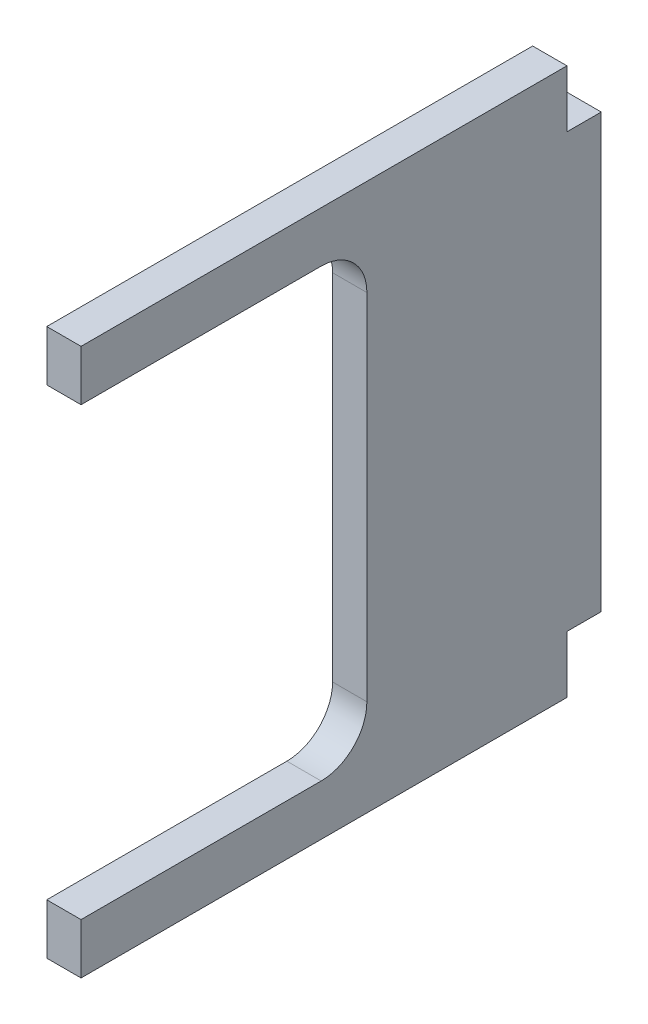
ISO-10303-21;
HEADER;
FILE_DESCRIPTION(('STEP AP214'),'2;1');
FILE_NAME('part.step','',(''),(''),'','','');
FILE_SCHEMA(('AUTOMOTIVE_DESIGN { 1 0 10303 214 1 1 1 1 }'));
ENDSEC;
DATA;
#1=APPLICATION_CONTEXT('core data for automotive mechanical design processes');
#2=APPLICATION_PROTOCOL_DEFINITION('international standard','automotive_design',2000,#1);
#3=PRODUCT_CONTEXT('',#1,'mechanical');
#4=PRODUCT('Part','Part','',(#3));
#5=PRODUCT_RELATED_PRODUCT_CATEGORY('part','',(#4));
#6=PRODUCT_DEFINITION_FORMATION('','',#4);
#7=PRODUCT_DEFINITION_CONTEXT('part definition',#1,'design');
#8=PRODUCT_DEFINITION('design','',#6,#7);
#9=PRODUCT_DEFINITION_SHAPE('','',#8);
#10=(LENGTH_UNIT() NAMED_UNIT(*) SI_UNIT(.MILLI.,.METRE.));
#11=(NAMED_UNIT(*) PLANE_ANGLE_UNIT() SI_UNIT($,.RADIAN.));
#12=(NAMED_UNIT(*) SI_UNIT($,.STERADIAN.) SOLID_ANGLE_UNIT());
#13=UNCERTAINTY_MEASURE_WITH_UNIT(LENGTH_MEASURE(1.E-05),#10,'distance_accuracy_value','');
#14=(GEOMETRIC_REPRESENTATION_CONTEXT(3) GLOBAL_UNCERTAINTY_ASSIGNED_CONTEXT((#13)) GLOBAL_UNIT_ASSIGNED_CONTEXT((#10,
#11,#12)) REPRESENTATION_CONTEXT('',''));
#15=CARTESIAN_POINT('',(0.,0.,0.));
#16=DIRECTION('',(0.,0.,1.));
#17=DIRECTION('',(1.,0.,0.));
#18=AXIS2_PLACEMENT_3D('',#15,#16,#17);
#19=CARTESIAN_POINT('',(-226.5,-18.9239385297092,55.466587914966));
#20=DIRECTION('',(1.,0.,0.));
#21=DIRECTION('',(0.,0.,-1.));
#22=AXIS2_PLACEMENT_3D('',#19,#20,#21);
#23=PLANE('',#22);
#24=DIRECTION('',(0.,0.,1.));
#25=VECTOR('',#24,1.);
#26=CARTESIAN_POINT('',(-226.5,-19.5000000000002,55.466587914966));
#27=LINE('',#26,#25);
#28=CARTESIAN_POINT('',(-226.5,-19.5000000000002,21.5));
#29=VERTEX_POINT('',#28);
#30=CARTESIAN_POINT('',(-226.5,-19.5000000000002,42.5));
#31=VERTEX_POINT('',#30);
#32=EDGE_CURVE('E150',#29,#31,#27,.T.);
#33=ORIENTED_EDGE('',*,*,#32,.F.);
#34=CARTESIAN_POINT('',(-226.5,-15.5000000000002,21.5));
#35=DIRECTION('',(1.,0.,0.));
#36=DIRECTION('',(0.,0.,-1.));
#37=AXIS2_PLACEMENT_3D('',#34,#35,#36);
#38=CIRCLE('',#37,4.);
#39=CARTESIAN_POINT('',(-226.5,-15.5000000000002,17.5));
#40=VERTEX_POINT('',#39);
#41=EDGE_CURVE('E11',#29,#40,#38,.T.);
#42=ORIENTED_EDGE('',*,*,#41,.T.);
#43=DIRECTION('',(0.,-1.,0.));
#44=VECTOR('',#43,1.);
#45=CARTESIAN_POINT('',(-226.5,-18.9239385297092,17.5));
#46=LINE('',#45,#44);
#47=CARTESIAN_POINT('',(-226.5,15.5000000000002,17.5));
#48=VERTEX_POINT('',#47);
#49=EDGE_CURVE('E219',#48,#40,#46,.T.);
#50=ORIENTED_EDGE('',*,*,#49,.F.);
#51=CARTESIAN_POINT('',(-226.5,15.5000000000002,21.5));
#52=DIRECTION('',(1.,0.,0.));
#53=DIRECTION('',(0.,0.,-1.));
#54=AXIS2_PLACEMENT_3D('',#51,#52,#53);
#55=CIRCLE('',#54,4.);
#56=CARTESIAN_POINT('',(-226.5,19.5000000000002,21.5));
#57=VERTEX_POINT('',#56);
#58=EDGE_CURVE('E225',#48,#57,#55,.T.);
#59=ORIENTED_EDGE('',*,*,#58,.T.);
#60=DIRECTION('',(0.,0.,1.));
#61=VECTOR('',#60,1.);
#62=CARTESIAN_POINT('',(-226.5,19.5000000000002,55.466587914966));
#63=LINE('',#62,#61);
#64=CARTESIAN_POINT('',(-226.5,19.5000000000002,42.5));
#65=VERTEX_POINT('',#64);
#66=EDGE_CURVE('E173',#57,#65,#63,.T.);
#67=ORIENTED_EDGE('',*,*,#66,.T.);
#68=DIRECTION('',(0.,-1.,0.));
#69=VECTOR('',#68,1.);
#70=CARTESIAN_POINT('',(-226.5,23.9239385297092,42.5));
#71=LINE('',#70,#69);
#72=CARTESIAN_POINT('',(-226.5,23.9239385297092,42.5));
#73=VERTEX_POINT('',#72);
#74=EDGE_CURVE('E269',#73,#65,#71,.T.);
#75=ORIENTED_EDGE('',*,*,#74,.F.);
#76=DIRECTION('',(0.,0.,1.));
#77=VECTOR('',#76,1.);
#78=CARTESIAN_POINT('',(-226.5,23.9239385297092,0.));
#79=LINE('',#78,#77);
#80=CARTESIAN_POINT('',(-226.5,23.9239385297092,0.));
#81=VERTEX_POINT('',#80);
#82=EDGE_CURVE('E177',#81,#73,#79,.T.);
#83=ORIENTED_EDGE('',*,*,#82,.F.);
#84=DIRECTION('',(0.,-1.,0.));
#85=VECTOR('',#84,1.);
#86=CARTESIAN_POINT('',(-226.5,23.9239385297092,0.));
#87=LINE('',#86,#85);
#88=CARTESIAN_POINT('',(-226.5,18.9239385297092,0.));
#89=VERTEX_POINT('',#88);
#90=EDGE_CURVE('E189',#81,#89,#87,.T.);
#91=ORIENTED_EDGE('',*,*,#90,.T.);
#92=DIRECTION('',(0.,0.,-1.));
#93=VECTOR('',#92,1.);
#94=CARTESIAN_POINT('',(-226.5,18.9239385297092,55.466587914966));
#95=LINE('',#94,#93);
#96=CARTESIAN_POINT('',(-226.5,18.9239385297092,-3.));
#97=VERTEX_POINT('',#96);
#98=EDGE_CURVE('E198',#89,#97,#95,.T.);
#99=ORIENTED_EDGE('',*,*,#98,.T.);
#100=DIRECTION('',(0.,-1.,0.));
#101=VECTOR('',#100,1.);
#102=CARTESIAN_POINT('',(-226.5,-18.9239385297092,-3.));
#103=LINE('',#102,#101);
#104=CARTESIAN_POINT('',(-226.5,-18.9239385297092,-3.));
#105=VERTEX_POINT('',#104);
#106=EDGE_CURVE('E263',#97,#105,#103,.T.);
#107=ORIENTED_EDGE('',*,*,#106,.T.);
#108=DIRECTION('',(0.,0.,-1.));
#109=VECTOR('',#108,1.);
#110=CARTESIAN_POINT('',(-226.5,-18.9239385297092,55.466587914966));
#111=LINE('',#110,#109);
#112=CARTESIAN_POINT('',(-226.5,-18.9239385297092,0.));
#113=VERTEX_POINT('',#112);
#114=EDGE_CURVE('E240',#113,#105,#111,.T.);
#115=ORIENTED_EDGE('',*,*,#114,.F.);
#116=DIRECTION('',(0.,1.,0.));
#117=VECTOR('',#116,1.);
#118=CARTESIAN_POINT('',(-226.5,-23.9239385297092,0.));
#119=LINE('',#118,#117);
#120=CARTESIAN_POINT('',(-226.5,-23.9239385297092,0.));
#121=VERTEX_POINT('',#120);
#122=EDGE_CURVE('E161',#121,#113,#119,.T.);
#123=ORIENTED_EDGE('',*,*,#122,.F.);
#124=DIRECTION('',(0.,0.,1.));
#125=VECTOR('',#124,1.);
#126=CARTESIAN_POINT('',(-226.5,-23.9239385297092,0.));
#127=LINE('',#126,#125);
#128=CARTESIAN_POINT('',(-226.5,-23.9239385297092,42.5));
#129=VERTEX_POINT('',#128);
#130=EDGE_CURVE('E300',#121,#129,#127,.T.);
#131=ORIENTED_EDGE('',*,*,#130,.T.);
#132=DIRECTION('',(0.,1.,0.));
#133=VECTOR('',#132,1.);
#134=CARTESIAN_POINT('',(-226.5,-23.9239385297092,42.5));
#135=LINE('',#134,#133);
#136=EDGE_CURVE('E159',#129,#31,#135,.T.);
#137=ORIENTED_EDGE('',*,*,#136,.T.);
#138=EDGE_LOOP('',(#33,#42,#50,#59,#67,#75,#83,#91,#99,#107,#115,#123,#131,#137));
#139=FACE_BOUND('',#138,.T.);
#140=ADVANCED_FACE('F39',(#139),#23,.F.);
#141=CARTESIAN_POINT('',(-223.5,18.9239385297092,55.466587914966));
#142=DIRECTION('',(-1.,0.,0.));
#143=DIRECTION('',(0.,0.,1.));
#144=AXIS2_PLACEMENT_3D('',#141,#142,#143);
#145=PLANE('',#144);
#146=DIRECTION('',(0.,1.,0.));
#147=VECTOR('',#146,1.);
#148=CARTESIAN_POINT('',(-223.5,18.9239385297092,17.5));
#149=LINE('',#148,#147);
#150=CARTESIAN_POINT('',(-223.5,-15.5000000000002,17.5));
#151=VERTEX_POINT('',#150);
#152=CARTESIAN_POINT('',(-223.5,15.5000000000002,17.5));
#153=VERTEX_POINT('',#152);
#154=EDGE_CURVE('E215',#151,#153,#149,.T.);
#155=ORIENTED_EDGE('',*,*,#154,.F.);
#156=CARTESIAN_POINT('',(-223.5,-15.5000000000002,21.5));
#157=DIRECTION('',(-1.,0.,0.));
#158=DIRECTION('',(0.,0.,1.));
#159=AXIS2_PLACEMENT_3D('',#156,#157,#158);
#160=CIRCLE('',#159,4.);
#161=CARTESIAN_POINT('',(-223.5,-19.5000000000002,21.5));
#162=VERTEX_POINT('',#161);
#163=EDGE_CURVE('E47',#151,#162,#160,.T.);
#164=ORIENTED_EDGE('',*,*,#163,.T.);
#165=DIRECTION('',(0.,0.,1.));
#166=VECTOR('',#165,1.);
#167=CARTESIAN_POINT('',(-223.5,-19.5000000000002,17.5));
#168=LINE('',#167,#166);
#169=CARTESIAN_POINT('',(-223.5,-19.5000000000002,42.5));
#170=VERTEX_POINT('',#169);
#171=EDGE_CURVE('E139',#162,#170,#168,.T.);
#172=ORIENTED_EDGE('',*,*,#171,.T.);
#173=DIRECTION('',(0.,1.,0.));
#174=VECTOR('',#173,1.);
#175=CARTESIAN_POINT('',(-223.5,-23.9239385297092,42.5));
#176=LINE('',#175,#174);
#177=CARTESIAN_POINT('',(-223.5,-23.9239385297092,42.5));
#178=VERTEX_POINT('',#177);
#179=EDGE_CURVE('E144',#178,#170,#176,.T.);
#180=ORIENTED_EDGE('',*,*,#179,.F.);
#181=DIRECTION('',(0.,0.,-1.));
#182=VECTOR('',#181,1.);
#183=CARTESIAN_POINT('',(-223.5,-23.9239385297092,0.));
#184=LINE('',#183,#182);
#185=CARTESIAN_POINT('',(-223.5,-23.9239385297092,0.));
#186=VERTEX_POINT('',#185);
#187=EDGE_CURVE('E306',#178,#186,#184,.T.);
#188=ORIENTED_EDGE('',*,*,#187,.T.);
#189=DIRECTION('',(0.,1.,0.));
#190=VECTOR('',#189,1.);
#191=CARTESIAN_POINT('',(-223.5,-23.9239385297092,0.));
#192=LINE('',#191,#190);
#193=CARTESIAN_POINT('',(-223.5,-18.9239385297092,0.));
#194=VERTEX_POINT('',#193);
#195=EDGE_CURVE('E158',#186,#194,#192,.T.);
#196=ORIENTED_EDGE('',*,*,#195,.T.);
#197=DIRECTION('',(0.,0.,-1.));
#198=VECTOR('',#197,1.);
#199=CARTESIAN_POINT('',(-223.5,-18.9239385297092,55.466587914966));
#200=LINE('',#199,#198);
#201=CARTESIAN_POINT('',(-223.5,-18.9239385297092,-3.));
#202=VERTEX_POINT('',#201);
#203=EDGE_CURVE('E220',#194,#202,#200,.T.);
#204=ORIENTED_EDGE('',*,*,#203,.T.);
#205=DIRECTION('',(0.,1.,0.));
#206=VECTOR('',#205,1.);
#207=CARTESIAN_POINT('',(-223.5,18.9239385297092,-3.));
#208=LINE('',#207,#206);
#209=CARTESIAN_POINT('',(-223.5,18.9239385297092,-3.));
#210=VERTEX_POINT('',#209);
#211=EDGE_CURVE('E257',#202,#210,#208,.T.);
#212=ORIENTED_EDGE('',*,*,#211,.T.);
#213=DIRECTION('',(0.,0.,-1.));
#214=VECTOR('',#213,1.);
#215=CARTESIAN_POINT('',(-223.5,18.9239385297092,55.466587914966));
#216=LINE('',#215,#214);
#217=CARTESIAN_POINT('',(-223.5,18.9239385297092,0.));
#218=VERTEX_POINT('',#217);
#219=EDGE_CURVE('E251',#218,#210,#216,.T.);
#220=ORIENTED_EDGE('',*,*,#219,.F.);
#221=DIRECTION('',(0.,-1.,0.));
#222=VECTOR('',#221,1.);
#223=CARTESIAN_POINT('',(-223.5,23.9239385297092,0.));
#224=LINE('',#223,#222);
#225=CARTESIAN_POINT('',(-223.5,23.9239385297092,0.));
#226=VERTEX_POINT('',#225);
#227=EDGE_CURVE('E203',#226,#218,#224,.T.);
#228=ORIENTED_EDGE('',*,*,#227,.F.);
#229=DIRECTION('',(0.,0.,-1.));
#230=VECTOR('',#229,1.);
#231=CARTESIAN_POINT('',(-223.5,23.9239385297092,0.));
#232=LINE('',#231,#230);
#233=CARTESIAN_POINT('',(-223.5,23.9239385297092,42.5));
#234=VERTEX_POINT('',#233);
#235=EDGE_CURVE('E184',#234,#226,#232,.T.);
#236=ORIENTED_EDGE('',*,*,#235,.F.);
#237=DIRECTION('',(0.,-1.,0.));
#238=VECTOR('',#237,1.);
#239=CARTESIAN_POINT('',(-223.5,23.9239385297092,42.5));
#240=LINE('',#239,#238);
#241=CARTESIAN_POINT('',(-223.5,19.5000000000002,42.5));
#242=VERTEX_POINT('',#241);
#243=EDGE_CURVE('E192',#234,#242,#240,.T.);
#244=ORIENTED_EDGE('',*,*,#243,.T.);
#245=DIRECTION('',(0.,0.,1.));
#246=VECTOR('',#245,1.);
#247=CARTESIAN_POINT('',(-223.5,19.5000000000002,17.5));
#248=LINE('',#247,#246);
#249=CARTESIAN_POINT('',(-223.5,19.5000000000002,21.5));
#250=VERTEX_POINT('',#249);
#251=EDGE_CURVE('E166',#250,#242,#248,.T.);
#252=ORIENTED_EDGE('',*,*,#251,.F.);
#253=CARTESIAN_POINT('',(-223.5,15.5000000000002,21.5));
#254=DIRECTION('',(-1.,0.,0.));
#255=DIRECTION('',(0.,0.,1.));
#256=AXIS2_PLACEMENT_3D('',#253,#254,#255);
#257=CIRCLE('',#256,4.);
#258=EDGE_CURVE('E229',#250,#153,#257,.T.);
#259=ORIENTED_EDGE('',*,*,#258,.T.);
#260=EDGE_LOOP('',(#155,#164,#172,#180,#188,#196,#204,#212,#220,#228,#236,#244,#252,#259));
#261=FACE_BOUND('',#260,.T.);
#262=ADVANCED_FACE('F141',(#261),#145,.F.);
#263=CARTESIAN_POINT('',(-226.5,-23.9239385297092,42.5));
#264=DIRECTION('',(0.,0.,1.));
#265=DIRECTION('',(1.,0.,0.));
#266=AXIS2_PLACEMENT_3D('',#263,#264,#265);
#267=PLANE('',#266);
#268=ORIENTED_EDGE('',*,*,#179,.T.);
#269=DIRECTION('',(1.,0.,0.));
#270=VECTOR('',#269,1.);
#271=CARTESIAN_POINT('',(-233.5,-19.5000000000002,42.5));
#272=LINE('',#271,#270);
#273=EDGE_CURVE('E146',#31,#170,#272,.T.);
#274=ORIENTED_EDGE('',*,*,#273,.F.);
#275=ORIENTED_EDGE('',*,*,#136,.F.);
#276=DIRECTION('',(1.,0.,0.));
#277=VECTOR('',#276,1.);
#278=CARTESIAN_POINT('',(-226.5,-23.9239385297092,42.5));
#279=LINE('',#278,#277);
#280=EDGE_CURVE('E157',#129,#178,#279,.T.);
#281=ORIENTED_EDGE('',*,*,#280,.T.);
#282=EDGE_LOOP('',(#268,#274,#275,#281));
#283=FACE_BOUND('',#282,.T.);
#284=ADVANCED_FACE('F155',(#283),#267,.T.);
#285=CARTESIAN_POINT('',(-226.5,18.9239385297092,55.466587914966));
#286=DIRECTION('',(0.,-1.,0.));
#287=DIRECTION('',(0.,0.,-1.));
#288=AXIS2_PLACEMENT_3D('',#285,#286,#287);
#289=PLANE('',#288);
#290=DIRECTION('',(-1.,0.,0.));
#291=VECTOR('',#290,1.);
#292=CARTESIAN_POINT('',(-226.5,18.9239385297092,0.));
#293=LINE('',#292,#291);
#294=EDGE_CURVE('E176',#218,#89,#293,.T.);
#295=ORIENTED_EDGE('',*,*,#294,.F.);
#296=ORIENTED_EDGE('',*,*,#219,.T.);
#297=DIRECTION('',(-1.,0.,0.));
#298=VECTOR('',#297,1.);
#299=CARTESIAN_POINT('',(-226.5,18.9239385297092,-3.));
#300=LINE('',#299,#298);
#301=EDGE_CURVE('E252',#210,#97,#300,.T.);
#302=ORIENTED_EDGE('',*,*,#301,.T.);
#303=ORIENTED_EDGE('',*,*,#98,.F.);
#304=EDGE_LOOP('',(#295,#296,#302,#303));
#305=FACE_BOUND('',#304,.T.);
#306=ADVANCED_FACE('F338',(#305),#289,.F.);
#307=CARTESIAN_POINT('',(-223.5,-18.9239385297092,55.466587914966));
#308=DIRECTION('',(0.,1.,0.));
#309=DIRECTION('',(0.,0.,1.));
#310=AXIS2_PLACEMENT_3D('',#307,#308,#309);
#311=PLANE('',#310);
#312=ORIENTED_EDGE('',*,*,#203,.F.);
#313=DIRECTION('',(-1.,0.,0.));
#314=VECTOR('',#313,1.);
#315=CARTESIAN_POINT('',(-226.5,-18.9239385297092,0.));
#316=LINE('',#315,#314);
#317=EDGE_CURVE('E297',#194,#113,#316,.T.);
#318=ORIENTED_EDGE('',*,*,#317,.T.);
#319=ORIENTED_EDGE('',*,*,#114,.T.);
#320=DIRECTION('',(1.,0.,0.));
#321=VECTOR('',#320,1.);
#322=CARTESIAN_POINT('',(-223.5,-18.9239385297092,-3.));
#323=LINE('',#322,#321);
#324=EDGE_CURVE('E260',#105,#202,#323,.T.);
#325=ORIENTED_EDGE('',*,*,#324,.T.);
#326=EDGE_LOOP('',(#312,#318,#319,#325));
#327=FACE_BOUND('',#326,.T.);
#328=ADVANCED_FACE('F317',(#327),#311,.F.);
#329=CARTESIAN_POINT('',(-195.,0.,17.5));
#330=DIRECTION('',(0.,0.,1.));
#331=DIRECTION('',(1.,0.,0.));
#332=AXIS2_PLACEMENT_3D('',#329,#330,#331);
#333=PLANE('',#332);
#334=ORIENTED_EDGE('',*,*,#49,.T.);
#335=DIRECTION('',(1.,0.,0.));
#336=VECTOR('',#335,1.);
#337=CARTESIAN_POINT('',(-223.5,-15.5000000000002,17.5));
#338=LINE('',#337,#336);
#339=EDGE_CURVE('E222',#40,#151,#338,.T.);
#340=ORIENTED_EDGE('',*,*,#339,.T.);
#341=ORIENTED_EDGE('',*,*,#154,.T.);
#342=DIRECTION('',(1.,0.,0.));
#343=VECTOR('',#342,1.);
#344=CARTESIAN_POINT('',(-195.,15.5000000000002,17.5));
#345=LINE('',#344,#343);
#346=EDGE_CURVE('E236',#153,#48,#345,.F.);
#347=ORIENTED_EDGE('',*,*,#346,.T.);
#348=EDGE_LOOP('',(#334,#340,#341,#347));
#349=FACE_BOUND('',#348,.T.);
#350=ADVANCED_FACE('F292',(#349),#333,.T.);
#351=CARTESIAN_POINT('',(0.,0.,-3.));
#352=DIRECTION('',(0.,0.,-1.));
#353=DIRECTION('',(0.,-1.,0.));
#354=AXIS2_PLACEMENT_3D('',#351,#352,#353);
#355=PLANE('',#354);
#356=ORIENTED_EDGE('',*,*,#301,.F.);
#357=ORIENTED_EDGE('',*,*,#211,.F.);
#358=ORIENTED_EDGE('',*,*,#324,.F.);
#359=ORIENTED_EDGE('',*,*,#106,.F.);
#360=EDGE_LOOP('',(#356,#357,#358,#359));
#361=FACE_BOUND('',#360,.T.);
#362=ADVANCED_FACE('F320',(#361),#355,.T.);
#363=CARTESIAN_POINT('',(-226.5,23.9239385297092,42.5));
#364=DIRECTION('',(0.,0.,-1.));
#365=DIRECTION('',(-1.,0.,0.));
#366=AXIS2_PLACEMENT_3D('',#363,#364,#365);
#367=PLANE('',#366);
#368=ORIENTED_EDGE('',*,*,#74,.T.);
#369=DIRECTION('',(1.,0.,0.));
#370=VECTOR('',#369,1.);
#371=CARTESIAN_POINT('',(-233.5,19.5000000000002,42.5));
#372=LINE('',#371,#370);
#373=EDGE_CURVE('E169',#65,#242,#372,.T.);
#374=ORIENTED_EDGE('',*,*,#373,.T.);
#375=ORIENTED_EDGE('',*,*,#243,.F.);
#376=DIRECTION('',(1.,0.,0.));
#377=VECTOR('',#376,1.);
#378=CARTESIAN_POINT('',(-226.5,23.9239385297092,42.5));
#379=LINE('',#378,#377);
#380=EDGE_CURVE('E181',#73,#234,#379,.T.);
#381=ORIENTED_EDGE('',*,*,#380,.F.);
#382=EDGE_LOOP('',(#368,#374,#375,#381));
#383=FACE_BOUND('',#382,.T.);
#384=ADVANCED_FACE('F282',(#383),#367,.F.);
#385=CARTESIAN_POINT('',(-226.5,23.9239385297092,0.));
#386=DIRECTION('',(0.,0.,1.));
#387=DIRECTION('',(1.,0.,0.));
#388=AXIS2_PLACEMENT_3D('',#385,#386,#387);
#389=PLANE('',#388);
#390=ORIENTED_EDGE('',*,*,#294,.T.);
#391=ORIENTED_EDGE('',*,*,#90,.F.);
#392=DIRECTION('',(-1.,0.,0.));
#393=VECTOR('',#392,1.);
#394=CARTESIAN_POINT('',(-226.5,23.9239385297092,0.));
#395=LINE('',#394,#393);
#396=EDGE_CURVE('E187',#226,#81,#395,.T.);
#397=ORIENTED_EDGE('',*,*,#396,.F.);
#398=ORIENTED_EDGE('',*,*,#227,.T.);
#399=EDGE_LOOP('',(#390,#391,#397,#398));
#400=FACE_BOUND('',#399,.T.);
#401=ADVANCED_FACE('F327',(#400),#389,.F.);
#402=CARTESIAN_POINT('',(0.,23.9239385297092,0.));
#403=DIRECTION('',(0.,1.,0.));
#404=DIRECTION('',(0.,0.,1.));
#405=AXIS2_PLACEMENT_3D('',#402,#403,#404);
#406=PLANE('',#405);
#407=ORIENTED_EDGE('',*,*,#82,.T.);
#408=ORIENTED_EDGE('',*,*,#380,.T.);
#409=ORIENTED_EDGE('',*,*,#235,.T.);
#410=ORIENTED_EDGE('',*,*,#396,.T.);
#411=EDGE_LOOP('',(#407,#408,#409,#410));
#412=FACE_BOUND('',#411,.T.);
#413=ADVANCED_FACE('F348',(#412),#406,.T.);
#414=CARTESIAN_POINT('',(-233.5,19.5000000000002,17.5));
#415=DIRECTION('',(0.,1.,0.));
#416=DIRECTION('',(-1.,0.,0.));
#417=AXIS2_PLACEMENT_3D('',#414,#415,#416);
#418=PLANE('',#417);
#419=ORIENTED_EDGE('',*,*,#66,.F.);
#420=DIRECTION('',(1.,0.,0.));
#421=VECTOR('',#420,1.);
#422=CARTESIAN_POINT('',(-233.5,19.5000000000002,21.5));
#423=LINE('',#422,#421);
#424=EDGE_CURVE('E288',#57,#250,#423,.T.);
#425=ORIENTED_EDGE('',*,*,#424,.T.);
#426=ORIENTED_EDGE('',*,*,#251,.T.);
#427=ORIENTED_EDGE('',*,*,#373,.F.);
#428=EDGE_LOOP('',(#419,#425,#426,#427));
#429=FACE_BOUND('',#428,.T.);
#430=ADVANCED_FACE('F285',(#429),#418,.F.);
#431=CARTESIAN_POINT('',(-233.5,15.5000000000002,21.5));
#432=DIRECTION('',(1.,0.,0.));
#433=DIRECTION('',(0.,1.,0.));
#434=AXIS2_PLACEMENT_3D('',#431,#432,#433);
#435=CYLINDRICAL_SURFACE('',#434,4.);
#436=ORIENTED_EDGE('',*,*,#58,.F.);
#437=ORIENTED_EDGE('',*,*,#346,.F.);
#438=ORIENTED_EDGE('',*,*,#258,.F.);
#439=ORIENTED_EDGE('',*,*,#424,.F.);
#440=EDGE_LOOP('',(#436,#437,#438,#439));
#441=FACE_BOUND('',#440,.T.);
#442=ADVANCED_FACE('F340',(#441),#435,.F.);
#443=CARTESIAN_POINT('',(-226.5,-23.9239385297092,0.));
#444=DIRECTION('',(0.,0.,-1.));
#445=DIRECTION('',(-1.,0.,0.));
#446=AXIS2_PLACEMENT_3D('',#443,#444,#445);
#447=PLANE('',#446);
#448=ORIENTED_EDGE('',*,*,#317,.F.);
#449=ORIENTED_EDGE('',*,*,#195,.F.);
#450=DIRECTION('',(-1.,0.,0.));
#451=VECTOR('',#450,1.);
#452=CARTESIAN_POINT('',(-226.5,-23.9239385297092,0.));
#453=LINE('',#452,#451);
#454=EDGE_CURVE('E303',#186,#121,#453,.T.);
#455=ORIENTED_EDGE('',*,*,#454,.T.);
#456=ORIENTED_EDGE('',*,*,#122,.T.);
#457=EDGE_LOOP('',(#448,#449,#455,#456));
#458=FACE_BOUND('',#457,.T.);
#459=ADVANCED_FACE('F314',(#458),#447,.T.);
#460=CARTESIAN_POINT('',(0.,-23.9239385297092,0.));
#461=DIRECTION('',(0.,-1.,0.));
#462=DIRECTION('',(0.,0.,1.));
#463=AXIS2_PLACEMENT_3D('',#460,#461,#462);
#464=PLANE('',#463);
#465=ORIENTED_EDGE('',*,*,#130,.F.);
#466=ORIENTED_EDGE('',*,*,#454,.F.);
#467=ORIENTED_EDGE('',*,*,#187,.F.);
#468=ORIENTED_EDGE('',*,*,#280,.F.);
#469=EDGE_LOOP('',(#465,#466,#467,#468));
#470=FACE_BOUND('',#469,.T.);
#471=ADVANCED_FACE('F346',(#470),#464,.T.);
#472=CARTESIAN_POINT('',(-233.5,-19.5000000000002,17.5));
#473=DIRECTION('',(0.,1.,0.));
#474=DIRECTION('',(-1.,0.,0.));
#475=AXIS2_PLACEMENT_3D('',#472,#473,#474);
#476=PLANE('',#475);
#477=ORIENTED_EDGE('',*,*,#171,.F.);
#478=DIRECTION('',(1.,0.,0.));
#479=VECTOR('',#478,1.);
#480=CARTESIAN_POINT('',(-226.5,-19.5000000000002,21.5));
#481=LINE('',#480,#479);
#482=EDGE_CURVE('E60',#162,#29,#481,.F.);
#483=ORIENTED_EDGE('',*,*,#482,.T.);
#484=ORIENTED_EDGE('',*,*,#32,.T.);
#485=ORIENTED_EDGE('',*,*,#273,.T.);
#486=EDGE_LOOP('',(#477,#483,#484,#485));
#487=FACE_BOUND('',#486,.T.);
#488=ADVANCED_FACE('F149',(#487),#476,.T.);
#489=CARTESIAN_POINT('',(-195.,-15.5000000000002,21.5));
#490=DIRECTION('',(-1.,0.,0.));
#491=DIRECTION('',(0.,-1.,0.));
#492=AXIS2_PLACEMENT_3D('',#489,#490,#491);
#493=CYLINDRICAL_SURFACE('',#492,4.);
#494=ORIENTED_EDGE('',*,*,#41,.F.);
#495=ORIENTED_EDGE('',*,*,#482,.F.);
#496=ORIENTED_EDGE('',*,*,#163,.F.);
#497=ORIENTED_EDGE('',*,*,#339,.F.);
#498=EDGE_LOOP('',(#494,#495,#496,#497));
#499=FACE_BOUND('',#498,.T.);
#500=ADVANCED_FACE('F41',(#499),#493,.F.);
#501=CLOSED_SHELL('',(#140,#262,#284,#306,#328,#350,#362,#384,#401,#413,#430,#442,#459,#471,
#488,#500));
#502=MANIFOLD_SOLID_BREP('B2',#501);
#503=ADVANCED_BREP_SHAPE_REPRESENTATION('',(#18,#502),#14);
#504=SHAPE_DEFINITION_REPRESENTATION(#9,#503);
ENDSEC;
END-ISO-10303-21;
